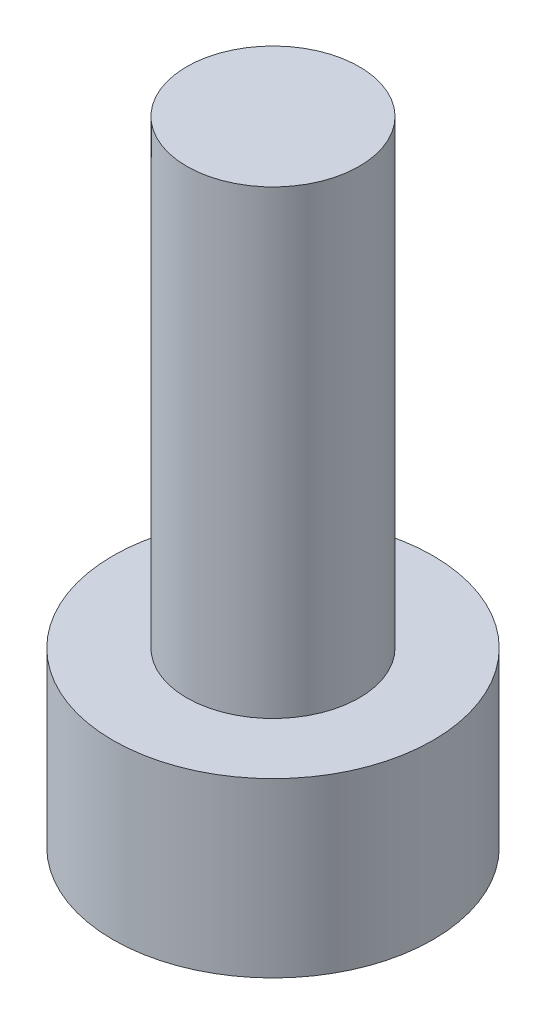
ISO-10303-21;
HEADER;
FILE_DESCRIPTION(('STEP AP214'),'2;1');
FILE_NAME('part.step','',(''),(''),'','','');
FILE_SCHEMA(('AUTOMOTIVE_DESIGN { 1 0 10303 214 1 1 1 1 }'));
ENDSEC;
DATA;
#1=APPLICATION_CONTEXT('core data for automotive mechanical design processes');
#2=APPLICATION_PROTOCOL_DEFINITION('international standard','automotive_design',2000,#1);
#3=PRODUCT_CONTEXT('',#1,'mechanical');
#4=PRODUCT('Part','Part','',(#3));
#5=PRODUCT_RELATED_PRODUCT_CATEGORY('part','',(#4));
#6=PRODUCT_DEFINITION_FORMATION('','',#4);
#7=PRODUCT_DEFINITION_CONTEXT('part definition',#1,'design');
#8=PRODUCT_DEFINITION('design','',#6,#7);
#9=PRODUCT_DEFINITION_SHAPE('','',#8);
#10=(LENGTH_UNIT() NAMED_UNIT(*) SI_UNIT(.MILLI.,.METRE.));
#11=(NAMED_UNIT(*) PLANE_ANGLE_UNIT() SI_UNIT($,.RADIAN.));
#12=(NAMED_UNIT(*) SI_UNIT($,.STERADIAN.) SOLID_ANGLE_UNIT());
#13=UNCERTAINTY_MEASURE_WITH_UNIT(LENGTH_MEASURE(1.E-05),#10,'distance_accuracy_value','');
#14=(GEOMETRIC_REPRESENTATION_CONTEXT(3) GLOBAL_UNCERTAINTY_ASSIGNED_CONTEXT((#13)) GLOBAL_UNIT_ASSIGNED_CONTEXT((#10,
#11,#12)) REPRESENTATION_CONTEXT('',''));
#15=CARTESIAN_POINT('',(0.,0.,0.));
#16=DIRECTION('',(0.,0.,1.));
#17=DIRECTION('',(1.,0.,0.));
#18=AXIS2_PLACEMENT_3D('',#15,#16,#17);
#19=CARTESIAN_POINT('',(0.,3.,0.));
#20=DIRECTION('',(0.,-1.,0.));
#21=DIRECTION('',(0.,0.,-1.));
#22=AXIS2_PLACEMENT_3D('',#19,#20,#21);
#23=CYLINDRICAL_SURFACE('',#22,2.78);
#24=CARTESIAN_POINT('',(0.,3.,0.));
#25=DIRECTION('',(0.,1.,0.));
#26=DIRECTION('',(0.,0.,1.));
#27=AXIS2_PLACEMENT_3D('',#24,#25,#26);
#28=CIRCLE('',#27,2.78);
#29=CARTESIAN_POINT('',(0.,3.,2.78));
#30=VERTEX_POINT('',#29);
#31=EDGE_CURVE('E10',#30,#30,#28,.T.);
#32=ORIENTED_EDGE('',*,*,#31,.F.);
#33=EDGE_LOOP('',(#32));
#34=FACE_BOUND('',#33,.T.);
#35=CARTESIAN_POINT('',(0.,0.,0.));
#36=DIRECTION('',(0.,1.,0.));
#37=DIRECTION('',(0.,0.,1.));
#38=AXIS2_PLACEMENT_3D('',#35,#36,#37);
#39=CIRCLE('',#38,2.78);
#40=CARTESIAN_POINT('',(0.,0.,2.78));
#41=VERTEX_POINT('',#40);
#42=EDGE_CURVE('E35',#41,#41,#39,.T.);
#43=ORIENTED_EDGE('',*,*,#42,.T.);
#44=EDGE_LOOP('',(#43));
#45=FACE_BOUND('',#44,.T.);
#46=ADVANCED_FACE('F32',(#34,#45),#23,.T.);
#47=CARTESIAN_POINT('',(0.,3.,0.));
#48=DIRECTION('',(0.,1.,0.));
#49=DIRECTION('',(0.,0.,1.));
#50=AXIS2_PLACEMENT_3D('',#47,#48,#49);
#51=PLANE('',#50);
#52=CARTESIAN_POINT('',(0.,3.,0.));
#53=DIRECTION('',(0.,1.,0.));
#54=DIRECTION('',(0.,0.,1.));
#55=AXIS2_PLACEMENT_3D('',#52,#53,#54);
#56=CIRCLE('',#55,1.5);
#57=CARTESIAN_POINT('',(0.,3.,1.5));
#58=VERTEX_POINT('',#57);
#59=EDGE_CURVE('E44',#58,#58,#56,.T.);
#60=ORIENTED_EDGE('',*,*,#59,.F.);
#61=EDGE_LOOP('',(#60));
#62=FACE_BOUND('',#61,.T.);
#63=ORIENTED_EDGE('',*,*,#31,.T.);
#64=EDGE_LOOP('',(#63));
#65=FACE_BOUND('',#64,.T.);
#66=ADVANCED_FACE('F59',(#62,#65),#51,.T.);
#67=CARTESIAN_POINT('',(0.,0.,0.));
#68=DIRECTION('',(0.,1.,0.));
#69=DIRECTION('',(0.,0.,1.));
#70=AXIS2_PLACEMENT_3D('',#67,#68,#69);
#71=PLANE('',#70);
#72=ORIENTED_EDGE('',*,*,#42,.F.);
#73=EDGE_LOOP('',(#72));
#74=FACE_BOUND('',#73,.T.);
#75=ADVANCED_FACE('F55',(#74),#71,.F.);
#76=CARTESIAN_POINT('',(0.,11.,0.));
#77=DIRECTION('',(0.,-1.,0.));
#78=DIRECTION('',(0.,0.,-1.));
#79=AXIS2_PLACEMENT_3D('',#76,#77,#78);
#80=CYLINDRICAL_SURFACE('',#79,1.5);
#81=CARTESIAN_POINT('',(0.,11.,0.));
#82=DIRECTION('',(0.,1.,0.));
#83=DIRECTION('',(0.,0.,1.));
#84=AXIS2_PLACEMENT_3D('',#81,#82,#83);
#85=CIRCLE('',#84,1.5);
#86=CARTESIAN_POINT('',(0.,11.,1.5));
#87=VERTEX_POINT('',#86);
#88=EDGE_CURVE('E42',#87,#87,#85,.T.);
#89=ORIENTED_EDGE('',*,*,#88,.F.);
#90=EDGE_LOOP('',(#89));
#91=FACE_BOUND('',#90,.T.);
#92=ORIENTED_EDGE('',*,*,#59,.T.);
#93=EDGE_LOOP('',(#92));
#94=FACE_BOUND('',#93,.T.);
#95=ADVANCED_FACE('F52',(#91,#94),#80,.T.);
#96=CARTESIAN_POINT('',(0.,11.,0.));
#97=DIRECTION('',(0.,1.,0.));
#98=DIRECTION('',(0.,0.,1.));
#99=AXIS2_PLACEMENT_3D('',#96,#97,#98);
#100=PLANE('',#99);
#101=ORIENTED_EDGE('',*,*,#88,.T.);
#102=EDGE_LOOP('',(#101));
#103=FACE_BOUND('',#102,.T.);
#104=ADVANCED_FACE('F50',(#103),#100,.T.);
#105=CLOSED_SHELL('',(#46,#66,#75,#95,#104));
#106=MANIFOLD_SOLID_BREP('B2',#105);
#107=ADVANCED_BREP_SHAPE_REPRESENTATION('',(#18,#106),#14);
#108=SHAPE_DEFINITION_REPRESENTATION(#9,#107);
ENDSEC;
END-ISO-10303-21;
